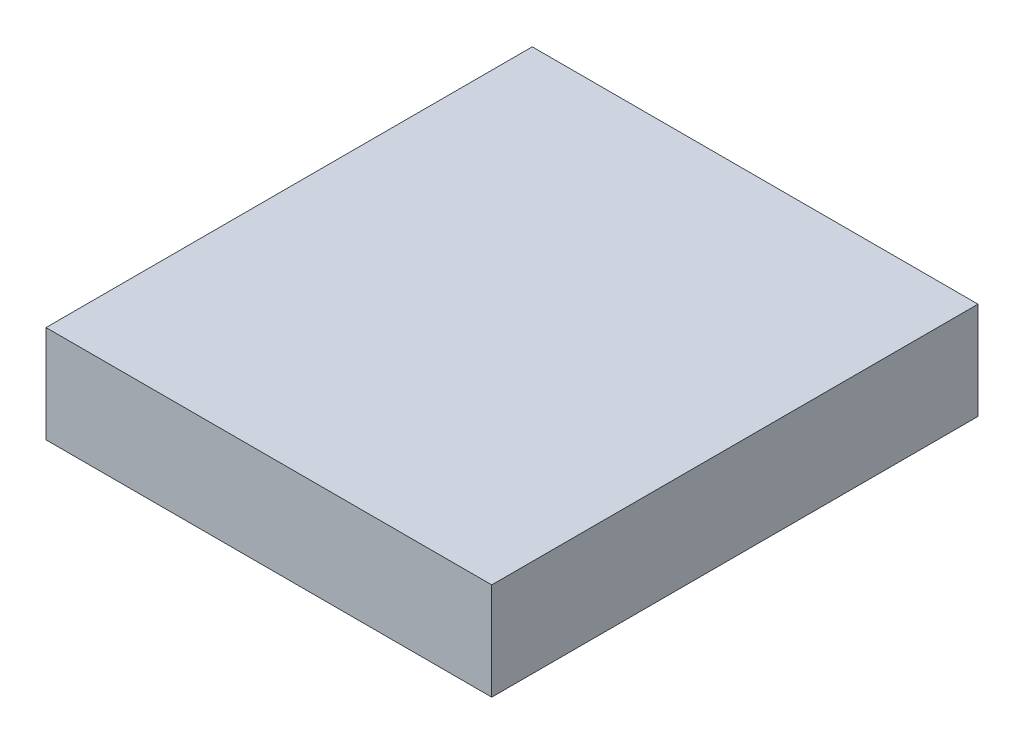
ISO-10303-21;
HEADER;
FILE_DESCRIPTION(('STEP AP214'),'2;1');
FILE_NAME('part.step','',(''),(''),'','','');
FILE_SCHEMA(('AUTOMOTIVE_DESIGN { 1 0 10303 214 1 1 1 1 }'));
ENDSEC;
DATA;
#1=APPLICATION_CONTEXT('core data for automotive mechanical design processes');
#2=APPLICATION_PROTOCOL_DEFINITION('international standard','automotive_design',2000,#1);
#3=PRODUCT_CONTEXT('',#1,'mechanical');
#4=PRODUCT('Part','Part','',(#3));
#5=PRODUCT_RELATED_PRODUCT_CATEGORY('part','',(#4));
#6=PRODUCT_DEFINITION_FORMATION('','',#4);
#7=PRODUCT_DEFINITION_CONTEXT('part definition',#1,'design');
#8=PRODUCT_DEFINITION('design','',#6,#7);
#9=PRODUCT_DEFINITION_SHAPE('','',#8);
#10=(LENGTH_UNIT() NAMED_UNIT(*) SI_UNIT(.MILLI.,.METRE.));
#11=(NAMED_UNIT(*) PLANE_ANGLE_UNIT() SI_UNIT($,.RADIAN.));
#12=(NAMED_UNIT(*) SI_UNIT($,.STERADIAN.) SOLID_ANGLE_UNIT());
#13=UNCERTAINTY_MEASURE_WITH_UNIT(LENGTH_MEASURE(1.E-05),#10,'distance_accuracy_value','');
#14=(GEOMETRIC_REPRESENTATION_CONTEXT(3) GLOBAL_UNCERTAINTY_ASSIGNED_CONTEXT((#13)) GLOBAL_UNIT_ASSIGNED_CONTEXT((#10,
#11,#12)) REPRESENTATION_CONTEXT('',''));
#15=CARTESIAN_POINT('',(0.,0.,0.));
#16=DIRECTION('',(0.,0.,1.));
#17=DIRECTION('',(1.,0.,0.));
#18=AXIS2_PLACEMENT_3D('',#15,#16,#17);
#19=CARTESIAN_POINT('',(-55.,24.,60.));
#20=DIRECTION('',(1.,0.,0.));
#21=DIRECTION('',(0.,0.,-1.));
#22=AXIS2_PLACEMENT_3D('',#19,#20,#21);
#23=PLANE('',#22);
#24=DIRECTION('',(0.,0.,1.));
#25=VECTOR('',#24,1.);
#26=CARTESIAN_POINT('',(-55.,0.,60.));
#27=LINE('',#26,#25);
#28=CARTESIAN_POINT('',(-55.,0.,-60.));
#29=VERTEX_POINT('',#28);
#30=CARTESIAN_POINT('',(-55.,0.,60.));
#31=VERTEX_POINT('',#30);
#32=EDGE_CURVE('E105',#29,#31,#27,.T.);
#33=ORIENTED_EDGE('',*,*,#32,.T.);
#34=DIRECTION('',(0.,-1.,0.));
#35=VECTOR('',#34,1.);
#36=CARTESIAN_POINT('',(-55.,24.,60.));
#37=LINE('',#36,#35);
#38=CARTESIAN_POINT('',(-55.,24.,60.));
#39=VERTEX_POINT('',#38);
#40=EDGE_CURVE('E11',#39,#31,#37,.T.);
#41=ORIENTED_EDGE('',*,*,#40,.F.);
#42=DIRECTION('',(0.,0.,1.));
#43=VECTOR('',#42,1.);
#44=CARTESIAN_POINT('',(-55.,24.,60.));
#45=LINE('',#44,#43);
#46=CARTESIAN_POINT('',(-55.,24.,-60.));
#47=VERTEX_POINT('',#46);
#48=EDGE_CURVE('E93',#47,#39,#45,.T.);
#49=ORIENTED_EDGE('',*,*,#48,.F.);
#50=DIRECTION('',(0.,-1.,0.));
#51=VECTOR('',#50,1.);
#52=CARTESIAN_POINT('',(-55.,24.,-60.));
#53=LINE('',#52,#51);
#54=EDGE_CURVE('E101',#47,#29,#53,.T.);
#55=ORIENTED_EDGE('',*,*,#54,.T.);
#56=EDGE_LOOP('',(#33,#41,#49,#55));
#57=FACE_BOUND('',#56,.T.);
#58=ADVANCED_FACE('F42',(#57),#23,.F.);
#59=CARTESIAN_POINT('',(55.,24.,60.));
#60=DIRECTION('',(0.,0.,-1.));
#61=DIRECTION('',(-1.,0.,0.));
#62=AXIS2_PLACEMENT_3D('',#59,#60,#61);
#63=PLANE('',#62);
#64=DIRECTION('',(1.,0.,0.));
#65=VECTOR('',#64,1.);
#66=CARTESIAN_POINT('',(55.,0.,60.));
#67=LINE('',#66,#65);
#68=CARTESIAN_POINT('',(55.,0.,60.));
#69=VERTEX_POINT('',#68);
#70=EDGE_CURVE('E97',#31,#69,#67,.T.);
#71=ORIENTED_EDGE('',*,*,#70,.T.);
#72=DIRECTION('',(0.,-1.,0.));
#73=VECTOR('',#72,1.);
#74=CARTESIAN_POINT('',(55.,24.,60.));
#75=LINE('',#74,#73);
#76=CARTESIAN_POINT('',(55.,24.,60.));
#77=VERTEX_POINT('',#76);
#78=EDGE_CURVE('E50',#77,#69,#75,.T.);
#79=ORIENTED_EDGE('',*,*,#78,.F.);
#80=DIRECTION('',(1.,0.,0.));
#81=VECTOR('',#80,1.);
#82=CARTESIAN_POINT('',(55.,24.,60.));
#83=LINE('',#82,#81);
#84=EDGE_CURVE('E88',#39,#77,#83,.T.);
#85=ORIENTED_EDGE('',*,*,#84,.F.);
#86=ORIENTED_EDGE('',*,*,#40,.T.);
#87=EDGE_LOOP('',(#71,#79,#85,#86));
#88=FACE_BOUND('',#87,.T.);
#89=ADVANCED_FACE('F96',(#88),#63,.F.);
#90=CARTESIAN_POINT('',(55.,24.,60.));
#91=DIRECTION('',(-1.,0.,0.));
#92=DIRECTION('',(0.,0.,1.));
#93=AXIS2_PLACEMENT_3D('',#90,#91,#92);
#94=PLANE('',#93);
#95=DIRECTION('',(0.,0.,-1.));
#96=VECTOR('',#95,1.);
#97=CARTESIAN_POINT('',(55.,0.,60.));
#98=LINE('',#97,#96);
#99=CARTESIAN_POINT('',(55.,0.,-60.));
#100=VERTEX_POINT('',#99);
#101=EDGE_CURVE('E75',#69,#100,#98,.T.);
#102=ORIENTED_EDGE('',*,*,#101,.T.);
#103=DIRECTION('',(0.,-1.,0.));
#104=VECTOR('',#103,1.);
#105=CARTESIAN_POINT('',(55.,24.,-60.));
#106=LINE('',#105,#104);
#107=CARTESIAN_POINT('',(55.,24.,-60.));
#108=VERTEX_POINT('',#107);
#109=EDGE_CURVE('E98',#108,#100,#106,.T.);
#110=ORIENTED_EDGE('',*,*,#109,.F.);
#111=DIRECTION('',(0.,0.,-1.));
#112=VECTOR('',#111,1.);
#113=CARTESIAN_POINT('',(55.,24.,60.));
#114=LINE('',#113,#112);
#115=EDGE_CURVE('E91',#77,#108,#114,.T.);
#116=ORIENTED_EDGE('',*,*,#115,.F.);
#117=ORIENTED_EDGE('',*,*,#78,.T.);
#118=EDGE_LOOP('',(#102,#110,#116,#117));
#119=FACE_BOUND('',#118,.T.);
#120=ADVANCED_FACE('F99',(#119),#94,.F.);
#121=CARTESIAN_POINT('',(55.,24.,-60.));
#122=DIRECTION('',(0.,0.,1.));
#123=DIRECTION('',(1.,0.,0.));
#124=AXIS2_PLACEMENT_3D('',#121,#122,#123);
#125=PLANE('',#124);
#126=DIRECTION('',(-1.,0.,0.));
#127=VECTOR('',#126,1.);
#128=CARTESIAN_POINT('',(55.,0.,-60.));
#129=LINE('',#128,#127);
#130=EDGE_CURVE('E81',#100,#29,#129,.T.);
#131=ORIENTED_EDGE('',*,*,#130,.T.);
#132=ORIENTED_EDGE('',*,*,#54,.F.);
#133=DIRECTION('',(-1.,0.,0.));
#134=VECTOR('',#133,1.);
#135=CARTESIAN_POINT('',(55.,24.,-60.));
#136=LINE('',#135,#134);
#137=EDGE_CURVE('E58',#108,#47,#136,.T.);
#138=ORIENTED_EDGE('',*,*,#137,.F.);
#139=ORIENTED_EDGE('',*,*,#109,.T.);
#140=EDGE_LOOP('',(#131,#132,#138,#139));
#141=FACE_BOUND('',#140,.T.);
#142=ADVANCED_FACE('F112',(#141),#125,.F.);
#143=CARTESIAN_POINT('',(0.,24.,0.));
#144=DIRECTION('',(0.,1.,0.));
#145=DIRECTION('',(0.,0.,1.));
#146=AXIS2_PLACEMENT_3D('',#143,#144,#145);
#147=PLANE('',#146);
#148=ORIENTED_EDGE('',*,*,#48,.T.);
#149=ORIENTED_EDGE('',*,*,#84,.T.);
#150=ORIENTED_EDGE('',*,*,#115,.T.);
#151=ORIENTED_EDGE('',*,*,#137,.T.);
#152=EDGE_LOOP('',(#148,#149,#150,#151));
#153=FACE_BOUND('',#152,.T.);
#154=ADVANCED_FACE('F89',(#153),#147,.T.);
#155=CARTESIAN_POINT('',(0.,0.,0.));
#156=DIRECTION('',(0.,1.,0.));
#157=DIRECTION('',(0.,0.,1.));
#158=AXIS2_PLACEMENT_3D('',#155,#156,#157);
#159=PLANE('',#158);
#160=ORIENTED_EDGE('',*,*,#32,.F.);
#161=ORIENTED_EDGE('',*,*,#130,.F.);
#162=ORIENTED_EDGE('',*,*,#101,.F.);
#163=ORIENTED_EDGE('',*,*,#70,.F.);
#164=EDGE_LOOP('',(#160,#161,#162,#163));
#165=FACE_BOUND('',#164,.T.);
#166=ADVANCED_FACE('F115',(#165),#159,.F.);
#167=CLOSED_SHELL('',(#58,#89,#120,#142,#154,#166));
#168=MANIFOLD_SOLID_BREP('B2',#167);
#169=ADVANCED_BREP_SHAPE_REPRESENTATION('',(#18,#168),#14);
#170=SHAPE_DEFINITION_REPRESENTATION(#9,#169);
ENDSEC;
END-ISO-10303-21;
